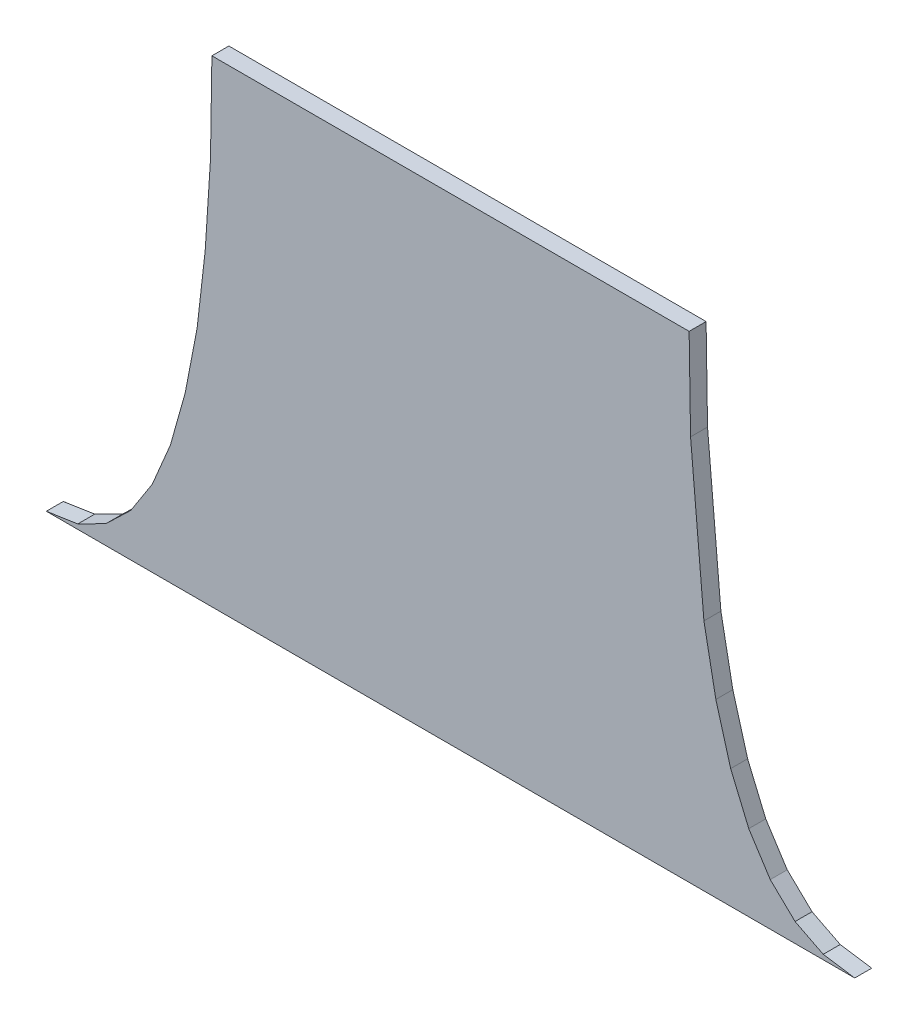
ISO-10303-21;
HEADER;
FILE_DESCRIPTION(('STEP AP214'),'2;1');
FILE_NAME('part.step','',(''),(''),'','','');
FILE_SCHEMA(('AUTOMOTIVE_DESIGN { 1 0 10303 214 1 1 1 1 }'));
ENDSEC;
DATA;
#1=APPLICATION_CONTEXT('core data for automotive mechanical design processes');
#2=APPLICATION_PROTOCOL_DEFINITION('international standard','automotive_design',2000,#1);
#3=PRODUCT_CONTEXT('',#1,'mechanical');
#4=PRODUCT('Part','Part','',(#3));
#5=PRODUCT_RELATED_PRODUCT_CATEGORY('part','',(#4));
#6=PRODUCT_DEFINITION_FORMATION('','',#4);
#7=PRODUCT_DEFINITION_CONTEXT('part definition',#1,'design');
#8=PRODUCT_DEFINITION('design','',#6,#7);
#9=PRODUCT_DEFINITION_SHAPE('','',#8);
#10=(LENGTH_UNIT() NAMED_UNIT(*) SI_UNIT(.MILLI.,.METRE.));
#11=(NAMED_UNIT(*) PLANE_ANGLE_UNIT() SI_UNIT($,.RADIAN.));
#12=(NAMED_UNIT(*) SI_UNIT($,.STERADIAN.) SOLID_ANGLE_UNIT());
#13=UNCERTAINTY_MEASURE_WITH_UNIT(LENGTH_MEASURE(1.E-05),#10,'distance_accuracy_value','');
#14=(GEOMETRIC_REPRESENTATION_CONTEXT(3) GLOBAL_UNCERTAINTY_ASSIGNED_CONTEXT((#13)) GLOBAL_UNIT_ASSIGNED_CONTEXT((#10,
#11,#12)) REPRESENTATION_CONTEXT('',''));
#15=CARTESIAN_POINT('',(0.,0.,0.));
#16=DIRECTION('',(0.,0.,1.));
#17=DIRECTION('',(1.,0.,0.));
#18=AXIS2_PLACEMENT_3D('',#15,#16,#17);
#19=CARTESIAN_POINT('',(45.5,64.4469985961914,0.));
#20=DIRECTION('',(0.999875499625645,-0.0157792664077773,0.));
#21=DIRECTION('',(-0.0157792664077773,-0.999875499625645,0.));
#22=AXIS2_PLACEMENT_3D('',#19,#20,#21);
#23=PLANE('',#22);
#24=DIRECTION('',(-0.0157792664077773,-0.999875499625645,0.));
#25=VECTOR('',#24,1.);
#26=CARTESIAN_POINT('',(45.5,64.4469985961914,0.03556));
#27=LINE('',#26,#25);
#28=CARTESIAN_POINT('',(45.5,64.4469985961914,0.03556));
#29=VERTEX_POINT('',#28);
#30=CARTESIAN_POINT('',(45.4970016479492,64.2570037841797,0.03556));
#31=VERTEX_POINT('',#30);
#32=EDGE_CURVE('E11',#29,#31,#27,.T.);
#33=ORIENTED_EDGE('',*,*,#32,.F.);
#34=DIRECTION('',(0.,0.,1.));
#35=VECTOR('',#34,1.);
#36=CARTESIAN_POINT('',(45.5,64.4469985961914,0.));
#37=LINE('',#36,#35);
#38=CARTESIAN_POINT('',(45.5,64.4469985961914,0.));
#39=VERTEX_POINT('',#38);
#40=EDGE_CURVE('E24',#39,#29,#37,.T.);
#41=ORIENTED_EDGE('',*,*,#40,.F.);
#42=DIRECTION('',(-0.0157792664077773,-0.999875499625645,0.));
#43=VECTOR('',#42,1.);
#44=CARTESIAN_POINT('',(45.5,64.4469985961914,0.));
#45=LINE('',#44,#43);
#46=CARTESIAN_POINT('',(45.4970016479492,64.2570037841797,0.));
#47=VERTEX_POINT('',#46);
#48=EDGE_CURVE('E178',#39,#47,#45,.T.);
#49=ORIENTED_EDGE('',*,*,#48,.T.);
#50=DIRECTION('',(0.,0.,1.));
#51=VECTOR('',#50,1.);
#52=CARTESIAN_POINT('',(45.4970016479492,64.2570037841797,0.));
#53=LINE('',#52,#51);
#54=EDGE_CURVE('E37',#47,#31,#53,.T.);
#55=ORIENTED_EDGE('',*,*,#54,.T.);
#56=EDGE_LOOP('',(#33,#41,#49,#55));
#57=FACE_BOUND('',#56,.T.);
#58=ADVANCED_FACE('F17',(#57),#23,.F.);
#59=CARTESIAN_POINT('',(45.4970016479492,64.2570037841797,0.));
#60=DIRECTION('',(0.997912666849635,-0.0645779323070131,0.));
#61=DIRECTION('',(-0.0645779323070131,-0.997912666849635,0.));
#62=AXIS2_PLACEMENT_3D('',#59,#60,#61);
#63=PLANE('',#62);
#64=DIRECTION('',(-0.0645779323070131,-0.997912666849635,0.));
#65=VECTOR('',#64,1.);
#66=CARTESIAN_POINT('',(45.4970016479492,64.2570037841797,0.03556));
#67=LINE('',#66,#65);
#68=CARTESIAN_POINT('',(45.4860000610352,64.0869979858398,0.03556));
#69=VERTEX_POINT('',#68);
#70=EDGE_CURVE('E322',#31,#69,#67,.T.);
#71=ORIENTED_EDGE('',*,*,#70,.F.);
#72=ORIENTED_EDGE('',*,*,#54,.F.);
#73=DIRECTION('',(-0.0645779323070131,-0.997912666849635,0.));
#74=VECTOR('',#73,1.);
#75=CARTESIAN_POINT('',(45.4970016479492,64.2570037841797,0.));
#76=LINE('',#75,#74);
#77=CARTESIAN_POINT('',(45.4860000610352,64.0869979858398,0.));
#78=VERTEX_POINT('',#77);
#79=EDGE_CURVE('E319',#47,#78,#76,.T.);
#80=ORIENTED_EDGE('',*,*,#79,.T.);
#81=DIRECTION('',(0.,0.,1.));
#82=VECTOR('',#81,1.);
#83=CARTESIAN_POINT('',(45.4860000610352,64.0869979858398,0.));
#84=LINE('',#83,#82);
#85=EDGE_CURVE('E317',#78,#69,#84,.T.);
#86=ORIENTED_EDGE('',*,*,#85,.T.);
#87=EDGE_LOOP('',(#71,#72,#80,#86));
#88=FACE_BOUND('',#87,.T.);
#89=ADVANCED_FACE('F330',(#88),#63,.F.);
#90=CARTESIAN_POINT('',(45.4860000610352,64.0869979858398,0.));
#91=DIRECTION('',(0.993640064778692,-0.112602938090431,0.));
#92=DIRECTION('',(-0.112602938090431,-0.993640064778692,0.));
#93=AXIS2_PLACEMENT_3D('',#90,#91,#92);
#94=PLANE('',#93);
#95=DIRECTION('',(-0.112602938090431,-0.993640064778692,0.));
#96=VECTOR('',#95,1.);
#97=CARTESIAN_POINT('',(45.4860000610352,64.0869979858398,0.03556));
#98=LINE('',#97,#96);
#99=CARTESIAN_POINT('',(45.4690017700195,63.9370002746582,0.03556));
#100=VERTEX_POINT('',#99);
#101=EDGE_CURVE('E314',#69,#100,#98,.T.);
#102=ORIENTED_EDGE('',*,*,#101,.F.);
#103=ORIENTED_EDGE('',*,*,#85,.F.);
#104=DIRECTION('',(-0.112602938090431,-0.993640064778692,0.));
#105=VECTOR('',#104,1.);
#106=CARTESIAN_POINT('',(45.4860000610352,64.0869979858398,0.));
#107=LINE('',#106,#105);
#108=CARTESIAN_POINT('',(45.4690017700195,63.9370002746582,0.));
#109=VERTEX_POINT('',#108);
#110=EDGE_CURVE('E311',#78,#109,#107,.T.);
#111=ORIENTED_EDGE('',*,*,#110,.T.);
#112=DIRECTION('',(0.,0.,1.));
#113=VECTOR('',#112,1.);
#114=CARTESIAN_POINT('',(45.4690017700195,63.9370002746582,0.));
#115=LINE('',#114,#113);
#116=EDGE_CURVE('E309',#109,#100,#115,.T.);
#117=ORIENTED_EDGE('',*,*,#116,.T.);
#118=EDGE_LOOP('',(#102,#103,#111,#117));
#119=FACE_BOUND('',#118,.T.);
#120=ADVANCED_FACE('F336',(#119),#94,.F.);
#121=CARTESIAN_POINT('',(45.4690017700195,63.9370002746582,0.));
#122=DIRECTION('',(0.982004597148876,-0.18885701252131,0.));
#123=DIRECTION('',(-0.18885701252131,-0.982004597148876,0.));
#124=AXIS2_PLACEMENT_3D('',#121,#122,#123);
#125=PLANE('',#124);
#126=DIRECTION('',(-0.18885701252131,-0.982004597148876,0.));
#127=VECTOR('',#126,1.);
#128=CARTESIAN_POINT('',(45.4690017700195,63.9370002746582,0.03556));
#129=LINE('',#128,#127);
#130=CARTESIAN_POINT('',(45.4440002441406,63.806999206543,0.03556));
#131=VERTEX_POINT('',#130);
#132=EDGE_CURVE('E306',#100,#131,#129,.T.);
#133=ORIENTED_EDGE('',*,*,#132,.F.);
#134=ORIENTED_EDGE('',*,*,#116,.F.);
#135=DIRECTION('',(-0.18885701252131,-0.982004597148876,0.));
#136=VECTOR('',#135,1.);
#137=CARTESIAN_POINT('',(45.4690017700195,63.9370002746582,0.));
#138=LINE('',#137,#136);
#139=CARTESIAN_POINT('',(45.4440002441406,63.806999206543,0.));
#140=VERTEX_POINT('',#139);
#141=EDGE_CURVE('E303',#109,#140,#138,.T.);
#142=ORIENTED_EDGE('',*,*,#141,.T.);
#143=DIRECTION('',(0.,0.,1.));
#144=VECTOR('',#143,1.);
#145=CARTESIAN_POINT('',(45.4440002441406,63.806999206543,0.));
#146=LINE('',#145,#144);
#147=EDGE_CURVE('E301',#140,#131,#146,.T.);
#148=ORIENTED_EDGE('',*,*,#147,.T.);
#149=EDGE_LOOP('',(#133,#134,#142,#148));
#150=FACE_BOUND('',#149,.T.);
#151=ADVANCED_FACE('F338',(#150),#125,.F.);
#152=CARTESIAN_POINT('',(45.4440002441406,63.806999206543,0.));
#153=DIRECTION('',(0.962503993414484,-0.271267511252584,0.));
#154=DIRECTION('',(-0.271267511252584,-0.962503993414484,0.));
#155=AXIS2_PLACEMENT_3D('',#152,#153,#154);
#156=PLANE('',#155);
#157=DIRECTION('',(-0.271267511252584,-0.962503993414484,0.));
#158=VECTOR('',#157,1.);
#159=CARTESIAN_POINT('',(45.4440002441406,63.806999206543,0.03556));
#160=LINE('',#159,#158);
#161=CARTESIAN_POINT('',(45.4129981994629,63.6969985961914,0.03556));
#162=VERTEX_POINT('',#161);
#163=EDGE_CURVE('E298',#131,#162,#160,.T.);
#164=ORIENTED_EDGE('',*,*,#163,.F.);
#165=ORIENTED_EDGE('',*,*,#147,.F.);
#166=DIRECTION('',(-0.271267511252584,-0.962503993414484,0.));
#167=VECTOR('',#166,1.);
#168=CARTESIAN_POINT('',(45.4440002441406,63.806999206543,0.));
#169=LINE('',#168,#167);
#170=CARTESIAN_POINT('',(45.4129981994629,63.6969985961914,0.));
#171=VERTEX_POINT('',#170);
#172=EDGE_CURVE('E295',#140,#171,#169,.T.);
#173=ORIENTED_EDGE('',*,*,#172,.T.);
#174=DIRECTION('',(0.,0.,1.));
#175=VECTOR('',#174,1.);
#176=CARTESIAN_POINT('',(45.4129981994629,63.6969985961914,0.));
#177=LINE('',#176,#175);
#178=EDGE_CURVE('E293',#171,#162,#177,.T.);
#179=ORIENTED_EDGE('',*,*,#178,.T.);
#180=EDGE_LOOP('',(#164,#165,#173,#179));
#181=FACE_BOUND('',#180,.T.);
#182=ADVANCED_FACE('F343',(#181),#156,.F.);
#183=CARTESIAN_POINT('',(45.4129981994629,63.6969985961914,0.));
#184=DIRECTION('',(0.921256402010641,-0.388955835223498,0.));
#185=DIRECTION('',(-0.388955835223498,-0.921256402010641,0.));
#186=AXIS2_PLACEMENT_3D('',#183,#184,#185);
#187=PLANE('',#186);
#188=DIRECTION('',(-0.388955835223498,-0.921256402010641,0.));
#189=VECTOR('',#188,1.);
#190=CARTESIAN_POINT('',(45.4129981994629,63.6969985961914,0.03556));
#191=LINE('',#190,#189);
#192=CARTESIAN_POINT('',(45.375,63.6069984436035,0.03556));
#193=VERTEX_POINT('',#192);
#194=EDGE_CURVE('E290',#162,#193,#191,.T.);
#195=ORIENTED_EDGE('',*,*,#194,.F.);
#196=ORIENTED_EDGE('',*,*,#178,.F.);
#197=DIRECTION('',(-0.388955835223498,-0.921256402010641,0.));
#198=VECTOR('',#197,1.);
#199=CARTESIAN_POINT('',(45.4129981994629,63.6969985961914,0.));
#200=LINE('',#199,#198);
#201=CARTESIAN_POINT('',(45.375,63.6069984436035,0.));
#202=VERTEX_POINT('',#201);
#203=EDGE_CURVE('E287',#171,#202,#200,.T.);
#204=ORIENTED_EDGE('',*,*,#203,.T.);
#205=DIRECTION('',(0.,0.,1.));
#206=VECTOR('',#205,1.);
#207=CARTESIAN_POINT('',(45.375,63.6069984436035,0.));
#208=LINE('',#207,#206);
#209=EDGE_CURVE('E285',#202,#193,#208,.T.);
#210=ORIENTED_EDGE('',*,*,#209,.T.);
#211=EDGE_LOOP('',(#195,#196,#204,#210));
#212=FACE_BOUND('',#211,.T.);
#213=ADVANCED_FACE('F346',(#212),#187,.F.);
#214=CARTESIAN_POINT('',(45.375,63.6069984436035,0.));
#215=DIRECTION('',(0.841187411828098,-0.540743689914128,0.));
#216=DIRECTION('',(-0.540743689914128,-0.841187411828098,0.));
#217=AXIS2_PLACEMENT_3D('',#214,#215,#216);
#218=PLANE('',#217);
#219=DIRECTION('',(-0.540743689914128,-0.841187411828098,0.));
#220=VECTOR('',#219,1.);
#221=CARTESIAN_POINT('',(45.375,63.6069984436035,0.03556));
#222=LINE('',#221,#220);
#223=CARTESIAN_POINT('',(45.3300018310547,63.5369987487793,0.03556));
#224=VERTEX_POINT('',#223);
#225=EDGE_CURVE('E282',#193,#224,#222,.T.);
#226=ORIENTED_EDGE('',*,*,#225,.F.);
#227=ORIENTED_EDGE('',*,*,#209,.F.);
#228=DIRECTION('',(-0.540743689914128,-0.841187411828098,0.));
#229=VECTOR('',#228,1.);
#230=CARTESIAN_POINT('',(45.375,63.6069984436035,0.));
#231=LINE('',#230,#229);
#232=CARTESIAN_POINT('',(45.3300018310547,63.5369987487793,0.));
#233=VERTEX_POINT('',#232);
#234=EDGE_CURVE('E279',#202,#233,#231,.T.);
#235=ORIENTED_EDGE('',*,*,#234,.T.);
#236=DIRECTION('',(0.,0.,1.));
#237=VECTOR('',#236,1.);
#238=CARTESIAN_POINT('',(45.3300018310547,63.5369987487793,0.));
#239=LINE('',#238,#237);
#240=EDGE_CURVE('E277',#233,#224,#239,.T.);
#241=ORIENTED_EDGE('',*,*,#240,.T.);
#242=EDGE_LOOP('',(#226,#227,#235,#241));
#243=FACE_BOUND('',#242,.T.);
#244=ADVANCED_FACE('F351',(#243),#218,.F.);
#245=CARTESIAN_POINT('',(45.3300018310547,63.5369987487793,0.));
#246=DIRECTION('',(0.693089694075239,-0.720851354973195,0.));
#247=DIRECTION('',(-0.720851354973195,-0.693089694075239,0.));
#248=AXIS2_PLACEMENT_3D('',#245,#246,#247);
#249=PLANE('',#248);
#250=DIRECTION('',(-0.720851354973195,-0.693089694075239,0.));
#251=VECTOR('',#250,1.);
#252=CARTESIAN_POINT('',(45.3300018310547,63.5369987487793,0.03556));
#253=LINE('',#252,#251);
#254=CARTESIAN_POINT('',(45.2779998779297,63.4869995117188,0.03556));
#255=VERTEX_POINT('',#254);
#256=EDGE_CURVE('E274',#224,#255,#253,.T.);
#257=ORIENTED_EDGE('',*,*,#256,.F.);
#258=ORIENTED_EDGE('',*,*,#240,.F.);
#259=DIRECTION('',(-0.720851354973195,-0.693089694075239,0.));
#260=VECTOR('',#259,1.);
#261=CARTESIAN_POINT('',(45.3300018310547,63.5369987487793,0.));
#262=LINE('',#261,#260);
#263=CARTESIAN_POINT('',(45.2779998779297,63.4869995117188,0.));
#264=VERTEX_POINT('',#263);
#265=EDGE_CURVE('E271',#233,#264,#262,.T.);
#266=ORIENTED_EDGE('',*,*,#265,.T.);
#267=DIRECTION('',(0.,0.,1.));
#268=VECTOR('',#267,1.);
#269=CARTESIAN_POINT('',(45.2779998779297,63.4869995117188,0.));
#270=LINE('',#269,#268);
#271=EDGE_CURVE('E269',#264,#255,#270,.T.);
#272=ORIENTED_EDGE('',*,*,#271,.T.);
#273=EDGE_LOOP('',(#257,#258,#266,#272));
#274=FACE_BOUND('',#273,.T.);
#275=ADVANCED_FACE('F354',(#274),#249,.F.);
#276=CARTESIAN_POINT('',(45.2779998779297,63.4869995117188,0.));
#277=DIRECTION('',(0.453243571621716,-0.891386708888791,0.));
#278=DIRECTION('',(-0.891386708888791,-0.453243571621716,0.));
#279=AXIS2_PLACEMENT_3D('',#276,#277,#278);
#280=PLANE('',#279);
#281=DIRECTION('',(-0.891386708888791,-0.453243571621716,0.));
#282=VECTOR('',#281,1.);
#283=CARTESIAN_POINT('',(45.2779998779297,63.4869995117188,0.03556));
#284=LINE('',#283,#282);
#285=CARTESIAN_POINT('',(45.2190017700195,63.4570007324219,0.03556));
#286=VERTEX_POINT('',#285);
#287=EDGE_CURVE('E266',#255,#286,#284,.T.);
#288=ORIENTED_EDGE('',*,*,#287,.F.);
#289=ORIENTED_EDGE('',*,*,#271,.F.);
#290=DIRECTION('',(-0.891386708888791,-0.453243571621716,0.));
#291=VECTOR('',#290,1.);
#292=CARTESIAN_POINT('',(45.2779998779297,63.4869995117188,0.));
#293=LINE('',#292,#291);
#294=CARTESIAN_POINT('',(45.2190017700195,63.4570007324219,0.));
#295=VERTEX_POINT('',#294);
#296=EDGE_CURVE('E263',#264,#295,#293,.T.);
#297=ORIENTED_EDGE('',*,*,#296,.T.);
#298=DIRECTION('',(0.,0.,1.));
#299=VECTOR('',#298,1.);
#300=CARTESIAN_POINT('',(45.2190017700195,63.4570007324219,0.));
#301=LINE('',#300,#299);
#302=EDGE_CURVE('E261',#295,#286,#301,.T.);
#303=ORIENTED_EDGE('',*,*,#302,.T.);
#304=EDGE_LOOP('',(#288,#289,#297,#303));
#305=FACE_BOUND('',#304,.T.);
#306=ADVANCED_FACE('F359',(#305),#280,.F.);
#307=CARTESIAN_POINT('',(45.2190017700195,63.4570007324219,0.));
#308=DIRECTION('',(0.149832463943078,-0.98871140013087,0.));
#309=DIRECTION('',(-0.98871140013087,-0.149832463943078,0.));
#310=AXIS2_PLACEMENT_3D('',#307,#308,#309);
#311=PLANE('',#310);
#312=DIRECTION('',(-0.98871140013087,-0.149832463943078,0.));
#313=VECTOR('',#312,1.);
#314=CARTESIAN_POINT('',(45.2190017700195,63.4570007324219,0.03556));
#315=LINE('',#314,#313);
#316=CARTESIAN_POINT('',(45.1529998779297,63.4469985961914,0.03556));
#317=VERTEX_POINT('',#316);
#318=EDGE_CURVE('E258',#286,#317,#315,.T.);
#319=ORIENTED_EDGE('',*,*,#318,.F.);
#320=ORIENTED_EDGE('',*,*,#302,.F.);
#321=DIRECTION('',(-0.98871140013087,-0.149832463943078,0.));
#322=VECTOR('',#321,1.);
#323=CARTESIAN_POINT('',(45.2190017700195,63.4570007324219,0.));
#324=LINE('',#323,#322);
#325=CARTESIAN_POINT('',(45.1529998779297,63.4469985961914,0.));
#326=VERTEX_POINT('',#325);
#327=EDGE_CURVE('E255',#295,#326,#324,.T.);
#328=ORIENTED_EDGE('',*,*,#327,.T.);
#329=DIRECTION('',(0.,0.,1.));
#330=VECTOR('',#329,1.);
#331=CARTESIAN_POINT('',(45.1529998779297,63.4469985961914,0.));
#332=LINE('',#331,#330);
#333=EDGE_CURVE('E253',#326,#317,#332,.T.);
#334=ORIENTED_EDGE('',*,*,#333,.T.);
#335=EDGE_LOOP('',(#319,#320,#328,#334));
#336=FACE_BOUND('',#335,.T.);
#337=ADVANCED_FACE('F362',(#336),#311,.F.);
#338=CARTESIAN_POINT('',(45.1529998779297,63.4469985961914,0.));
#339=DIRECTION('',(0.,1.,0.));
#340=DIRECTION('',(1.,0.,0.));
#341=AXIS2_PLACEMENT_3D('',#338,#339,#340);
#342=PLANE('',#341);
#343=DIRECTION('',(1.,0.,0.));
#344=VECTOR('',#343,1.);
#345=CARTESIAN_POINT('',(45.1529998779297,63.4469985961914,0.03556));
#346=LINE('',#345,#344);
#347=CARTESIAN_POINT('',(46.8470001220703,63.4469985961914,0.03556));
#348=VERTEX_POINT('',#347);
#349=EDGE_CURVE('E250',#317,#348,#346,.T.);
#350=ORIENTED_EDGE('',*,*,#349,.F.);
#351=ORIENTED_EDGE('',*,*,#333,.F.);
#352=DIRECTION('',(1.,0.,0.));
#353=VECTOR('',#352,1.);
#354=CARTESIAN_POINT('',(45.1529998779297,63.4469985961914,0.));
#355=LINE('',#354,#353);
#356=CARTESIAN_POINT('',(46.8470001220703,63.4469985961914,0.));
#357=VERTEX_POINT('',#356);
#358=EDGE_CURVE('E247',#326,#357,#355,.T.);
#359=ORIENTED_EDGE('',*,*,#358,.T.);
#360=DIRECTION('',(0.,0.,1.));
#361=VECTOR('',#360,1.);
#362=CARTESIAN_POINT('',(46.8470001220703,63.4469985961914,0.));
#363=LINE('',#362,#361);
#364=EDGE_CURVE('E245',#357,#348,#363,.T.);
#365=ORIENTED_EDGE('',*,*,#364,.T.);
#366=EDGE_LOOP('',(#350,#351,#359,#365));
#367=FACE_BOUND('',#366,.T.);
#368=ADVANCED_FACE('F367',(#367),#342,.F.);
#369=CARTESIAN_POINT('',(46.8470001220703,63.4469985961914,0.));
#370=DIRECTION('',(-0.149832463943078,-0.98871140013087,0.));
#371=DIRECTION('',(-0.98871140013087,0.149832463943078,0.));
#372=AXIS2_PLACEMENT_3D('',#369,#370,#371);
#373=PLANE('',#372);
#374=DIRECTION('',(-0.98871140013087,0.149832463943078,0.));
#375=VECTOR('',#374,1.);
#376=CARTESIAN_POINT('',(46.8470001220703,63.4469985961914,0.03556));
#377=LINE('',#376,#375);
#378=CARTESIAN_POINT('',(46.7809982299805,63.4570007324219,0.03556));
#379=VERTEX_POINT('',#378);
#380=EDGE_CURVE('E242',#348,#379,#377,.T.);
#381=ORIENTED_EDGE('',*,*,#380,.F.);
#382=ORIENTED_EDGE('',*,*,#364,.F.);
#383=DIRECTION('',(-0.98871140013087,0.149832463943078,0.));
#384=VECTOR('',#383,1.);
#385=CARTESIAN_POINT('',(46.8470001220703,63.4469985961914,0.));
#386=LINE('',#385,#384);
#387=CARTESIAN_POINT('',(46.7809982299805,63.4570007324219,0.));
#388=VERTEX_POINT('',#387);
#389=EDGE_CURVE('E239',#357,#388,#386,.T.);
#390=ORIENTED_EDGE('',*,*,#389,.T.);
#391=DIRECTION('',(0.,0.,1.));
#392=VECTOR('',#391,1.);
#393=CARTESIAN_POINT('',(46.7809982299805,63.4570007324219,0.));
#394=LINE('',#393,#392);
#395=EDGE_CURVE('E237',#388,#379,#394,.T.);
#396=ORIENTED_EDGE('',*,*,#395,.T.);
#397=EDGE_LOOP('',(#381,#382,#390,#396));
#398=FACE_BOUND('',#397,.T.);
#399=ADVANCED_FACE('F370',(#398),#373,.F.);
#400=CARTESIAN_POINT('',(46.7809982299805,63.4570007324219,0.));
#401=DIRECTION('',(-0.453243571621716,-0.891386708888791,0.));
#402=DIRECTION('',(-0.891386708888791,0.453243571621716,0.));
#403=AXIS2_PLACEMENT_3D('',#400,#401,#402);
#404=PLANE('',#403);
#405=DIRECTION('',(-0.891386708888791,0.453243571621716,0.));
#406=VECTOR('',#405,1.);
#407=CARTESIAN_POINT('',(46.7809982299805,63.4570007324219,0.03556));
#408=LINE('',#407,#406);
#409=CARTESIAN_POINT('',(46.7220001220703,63.4869995117188,0.03556));
#410=VERTEX_POINT('',#409);
#411=EDGE_CURVE('E234',#379,#410,#408,.T.);
#412=ORIENTED_EDGE('',*,*,#411,.F.);
#413=ORIENTED_EDGE('',*,*,#395,.F.);
#414=DIRECTION('',(-0.891386708888791,0.453243571621716,0.));
#415=VECTOR('',#414,1.);
#416=CARTESIAN_POINT('',(46.7809982299805,63.4570007324219,0.));
#417=LINE('',#416,#415);
#418=CARTESIAN_POINT('',(46.7220001220703,63.4869995117188,0.));
#419=VERTEX_POINT('',#418);
#420=EDGE_CURVE('E231',#388,#419,#417,.T.);
#421=ORIENTED_EDGE('',*,*,#420,.T.);
#422=DIRECTION('',(0.,0.,1.));
#423=VECTOR('',#422,1.);
#424=CARTESIAN_POINT('',(46.7220001220703,63.4869995117188,0.));
#425=LINE('',#424,#423);
#426=EDGE_CURVE('E229',#419,#410,#425,.T.);
#427=ORIENTED_EDGE('',*,*,#426,.T.);
#428=EDGE_LOOP('',(#412,#413,#421,#427));
#429=FACE_BOUND('',#428,.T.);
#430=ADVANCED_FACE('F375',(#429),#404,.F.);
#431=CARTESIAN_POINT('',(46.7220001220703,63.4869995117188,0.));
#432=DIRECTION('',(-0.693089694075239,-0.720851354973195,0.));
#433=DIRECTION('',(-0.720851354973195,0.693089694075239,0.));
#434=AXIS2_PLACEMENT_3D('',#431,#432,#433);
#435=PLANE('',#434);
#436=DIRECTION('',(-0.720851354973195,0.693089694075239,0.));
#437=VECTOR('',#436,1.);
#438=CARTESIAN_POINT('',(46.7220001220703,63.4869995117188,0.03556));
#439=LINE('',#438,#437);
#440=CARTESIAN_POINT('',(46.6699981689453,63.5369987487793,0.03556));
#441=VERTEX_POINT('',#440);
#442=EDGE_CURVE('E226',#410,#441,#439,.T.);
#443=ORIENTED_EDGE('',*,*,#442,.F.);
#444=ORIENTED_EDGE('',*,*,#426,.F.);
#445=DIRECTION('',(-0.720851354973195,0.693089694075239,0.));
#446=VECTOR('',#445,1.);
#447=CARTESIAN_POINT('',(46.7220001220703,63.4869995117188,0.));
#448=LINE('',#447,#446);
#449=CARTESIAN_POINT('',(46.6699981689453,63.5369987487793,0.));
#450=VERTEX_POINT('',#449);
#451=EDGE_CURVE('E223',#419,#450,#448,.T.);
#452=ORIENTED_EDGE('',*,*,#451,.T.);
#453=DIRECTION('',(0.,0.,1.));
#454=VECTOR('',#453,1.);
#455=CARTESIAN_POINT('',(46.6699981689453,63.5369987487793,0.));
#456=LINE('',#455,#454);
#457=EDGE_CURVE('E221',#450,#441,#456,.T.);
#458=ORIENTED_EDGE('',*,*,#457,.T.);
#459=EDGE_LOOP('',(#443,#444,#452,#458));
#460=FACE_BOUND('',#459,.T.);
#461=ADVANCED_FACE('F378',(#460),#435,.F.);
#462=CARTESIAN_POINT('',(46.6699981689453,63.5369987487793,0.));
#463=DIRECTION('',(-0.841187411828098,-0.540743689914128,0.));
#464=DIRECTION('',(-0.540743689914128,0.841187411828098,0.));
#465=AXIS2_PLACEMENT_3D('',#462,#463,#464);
#466=PLANE('',#465);
#467=DIRECTION('',(-0.540743689914128,0.841187411828098,0.));
#468=VECTOR('',#467,1.);
#469=CARTESIAN_POINT('',(46.6699981689453,63.5369987487793,0.03556));
#470=LINE('',#469,#468);
#471=CARTESIAN_POINT('',(46.625,63.6069984436035,0.03556));
#472=VERTEX_POINT('',#471);
#473=EDGE_CURVE('E218',#441,#472,#470,.T.);
#474=ORIENTED_EDGE('',*,*,#473,.F.);
#475=ORIENTED_EDGE('',*,*,#457,.F.);
#476=DIRECTION('',(-0.540743689914128,0.841187411828098,0.));
#477=VECTOR('',#476,1.);
#478=CARTESIAN_POINT('',(46.6699981689453,63.5369987487793,0.));
#479=LINE('',#478,#477);
#480=CARTESIAN_POINT('',(46.625,63.6069984436035,0.));
#481=VERTEX_POINT('',#480);
#482=EDGE_CURVE('E215',#450,#481,#479,.T.);
#483=ORIENTED_EDGE('',*,*,#482,.T.);
#484=DIRECTION('',(0.,0.,1.));
#485=VECTOR('',#484,1.);
#486=CARTESIAN_POINT('',(46.625,63.6069984436035,0.));
#487=LINE('',#486,#485);
#488=EDGE_CURVE('E213',#481,#472,#487,.T.);
#489=ORIENTED_EDGE('',*,*,#488,.T.);
#490=EDGE_LOOP('',(#474,#475,#483,#489));
#491=FACE_BOUND('',#490,.T.);
#492=ADVANCED_FACE('F383',(#491),#466,.F.);
#493=CARTESIAN_POINT('',(46.625,63.6069984436035,0.));
#494=DIRECTION('',(-0.921256402010641,-0.388955835223498,0.));
#495=DIRECTION('',(-0.388955835223498,0.921256402010641,0.));
#496=AXIS2_PLACEMENT_3D('',#493,#494,#495);
#497=PLANE('',#496);
#498=DIRECTION('',(-0.388955835223498,0.921256402010641,0.));
#499=VECTOR('',#498,1.);
#500=CARTESIAN_POINT('',(46.625,63.6069984436035,0.03556));
#501=LINE('',#500,#499);
#502=CARTESIAN_POINT('',(46.5870018005371,63.6969985961914,0.03556));
#503=VERTEX_POINT('',#502);
#504=EDGE_CURVE('E210',#472,#503,#501,.T.);
#505=ORIENTED_EDGE('',*,*,#504,.F.);
#506=ORIENTED_EDGE('',*,*,#488,.F.);
#507=DIRECTION('',(-0.388955835223498,0.921256402010641,0.));
#508=VECTOR('',#507,1.);
#509=CARTESIAN_POINT('',(46.625,63.6069984436035,0.));
#510=LINE('',#509,#508);
#511=CARTESIAN_POINT('',(46.5870018005371,63.6969985961914,0.));
#512=VERTEX_POINT('',#511);
#513=EDGE_CURVE('E207',#481,#512,#510,.T.);
#514=ORIENTED_EDGE('',*,*,#513,.T.);
#515=DIRECTION('',(0.,0.,1.));
#516=VECTOR('',#515,1.);
#517=CARTESIAN_POINT('',(46.5870018005371,63.6969985961914,0.));
#518=LINE('',#517,#516);
#519=EDGE_CURVE('E205',#512,#503,#518,.T.);
#520=ORIENTED_EDGE('',*,*,#519,.T.);
#521=EDGE_LOOP('',(#505,#506,#514,#520));
#522=FACE_BOUND('',#521,.T.);
#523=ADVANCED_FACE('F386',(#522),#497,.F.);
#524=CARTESIAN_POINT('',(46.5870018005371,63.6969985961914,0.));
#525=DIRECTION('',(-0.962503993414484,-0.271267511252584,0.));
#526=DIRECTION('',(-0.271267511252584,0.962503993414484,0.));
#527=AXIS2_PLACEMENT_3D('',#524,#525,#526);
#528=PLANE('',#527);
#529=DIRECTION('',(-0.271267511252584,0.962503993414484,0.));
#530=VECTOR('',#529,1.);
#531=CARTESIAN_POINT('',(46.5870018005371,63.6969985961914,0.03556));
#532=LINE('',#531,#530);
#533=CARTESIAN_POINT('',(46.5559997558594,63.806999206543,0.03556));
#534=VERTEX_POINT('',#533);
#535=EDGE_CURVE('E202',#503,#534,#532,.T.);
#536=ORIENTED_EDGE('',*,*,#535,.F.);
#537=ORIENTED_EDGE('',*,*,#519,.F.);
#538=DIRECTION('',(-0.271267511252584,0.962503993414484,0.));
#539=VECTOR('',#538,1.);
#540=CARTESIAN_POINT('',(46.5870018005371,63.6969985961914,0.));
#541=LINE('',#540,#539);
#542=CARTESIAN_POINT('',(46.5559997558594,63.806999206543,0.));
#543=VERTEX_POINT('',#542);
#544=EDGE_CURVE('E199',#512,#543,#541,.T.);
#545=ORIENTED_EDGE('',*,*,#544,.T.);
#546=DIRECTION('',(0.,0.,1.));
#547=VECTOR('',#546,1.);
#548=CARTESIAN_POINT('',(46.5559997558594,63.806999206543,0.));
#549=LINE('',#548,#547);
#550=EDGE_CURVE('E197',#543,#534,#549,.T.);
#551=ORIENTED_EDGE('',*,*,#550,.T.);
#552=EDGE_LOOP('',(#536,#537,#545,#551));
#553=FACE_BOUND('',#552,.T.);
#554=ADVANCED_FACE('F391',(#553),#528,.F.);
#555=CARTESIAN_POINT('',(46.5559997558594,63.806999206543,0.));
#556=DIRECTION('',(-0.982004597148876,-0.18885701252131,0.));
#557=DIRECTION('',(-0.18885701252131,0.982004597148876,0.));
#558=AXIS2_PLACEMENT_3D('',#555,#556,#557);
#559=PLANE('',#558);
#560=DIRECTION('',(-0.18885701252131,0.982004597148876,0.));
#561=VECTOR('',#560,1.);
#562=CARTESIAN_POINT('',(46.5559997558594,63.806999206543,0.03556));
#563=LINE('',#562,#561);
#564=CARTESIAN_POINT('',(46.5309982299805,63.9370002746582,0.03556));
#565=VERTEX_POINT('',#564);
#566=EDGE_CURVE('E194',#534,#565,#563,.T.);
#567=ORIENTED_EDGE('',*,*,#566,.F.);
#568=ORIENTED_EDGE('',*,*,#550,.F.);
#569=DIRECTION('',(-0.18885701252131,0.982004597148876,0.));
#570=VECTOR('',#569,1.);
#571=CARTESIAN_POINT('',(46.5559997558594,63.806999206543,0.));
#572=LINE('',#571,#570);
#573=CARTESIAN_POINT('',(46.5309982299805,63.9370002746582,0.));
#574=VERTEX_POINT('',#573);
#575=EDGE_CURVE('E191',#543,#574,#572,.T.);
#576=ORIENTED_EDGE('',*,*,#575,.T.);
#577=DIRECTION('',(0.,0.,1.));
#578=VECTOR('',#577,1.);
#579=CARTESIAN_POINT('',(46.5309982299805,63.9370002746582,0.));
#580=LINE('',#579,#578);
#581=EDGE_CURVE('E189',#574,#565,#580,.T.);
#582=ORIENTED_EDGE('',*,*,#581,.T.);
#583=EDGE_LOOP('',(#567,#568,#576,#582));
#584=FACE_BOUND('',#583,.T.);
#585=ADVANCED_FACE('F394',(#584),#559,.F.);
#586=CARTESIAN_POINT('',(46.5309982299805,63.9370002746582,0.));
#587=DIRECTION('',(-0.996193833505747,-0.0871656244463645,0.));
#588=DIRECTION('',(-0.0871656244463645,0.996193833505747,0.));
#589=AXIS2_PLACEMENT_3D('',#586,#587,#588);
#590=PLANE('',#589);
#591=DIRECTION('',(-0.0871656244463645,0.996193833505747,0.));
#592=VECTOR('',#591,1.);
#593=CARTESIAN_POINT('',(46.5309982299805,63.9370002746582,0.03556));
#594=LINE('',#593,#592);
#595=CARTESIAN_POINT('',(46.5029983520508,64.2570037841797,0.03556));
#596=VERTEX_POINT('',#595);
#597=EDGE_CURVE('E186',#565,#596,#594,.T.);
#598=ORIENTED_EDGE('',*,*,#597,.F.);
#599=ORIENTED_EDGE('',*,*,#581,.F.);
#600=DIRECTION('',(-0.0871656244463645,0.996193833505747,0.));
#601=VECTOR('',#600,1.);
#602=CARTESIAN_POINT('',(46.5309982299805,63.9370002746582,0.));
#603=LINE('',#602,#601);
#604=CARTESIAN_POINT('',(46.5029983520508,64.2570037841797,0.));
#605=VERTEX_POINT('',#604);
#606=EDGE_CURVE('E184',#574,#605,#603,.T.);
#607=ORIENTED_EDGE('',*,*,#606,.T.);
#608=DIRECTION('',(0.,0.,1.));
#609=VECTOR('',#608,1.);
#610=CARTESIAN_POINT('',(46.5029983520508,64.2570037841797,0.));
#611=LINE('',#610,#609);
#612=EDGE_CURVE('E169',#605,#596,#611,.T.);
#613=ORIENTED_EDGE('',*,*,#612,.T.);
#614=EDGE_LOOP('',(#598,#599,#607,#613));
#615=FACE_BOUND('',#614,.T.);
#616=ADVANCED_FACE('F397',(#615),#590,.F.);
#617=CARTESIAN_POINT('',(46.5029983520508,64.2570037841797,0.));
#618=DIRECTION('',(-0.999875499625645,-0.0157792664077773,0.));
#619=DIRECTION('',(-0.0157792664077773,0.999875499625645,0.));
#620=AXIS2_PLACEMENT_3D('',#617,#618,#619);
#621=PLANE('',#620);
#622=DIRECTION('',(-0.0157792664077773,0.999875499625645,0.));
#623=VECTOR('',#622,1.);
#624=CARTESIAN_POINT('',(46.5029983520508,64.2570037841797,0.03556));
#625=LINE('',#624,#623);
#626=CARTESIAN_POINT('',(46.5,64.4469985961914,0.03556));
#627=VERTEX_POINT('',#626);
#628=EDGE_CURVE('E173',#596,#627,#625,.T.);
#629=ORIENTED_EDGE('',*,*,#628,.F.);
#630=ORIENTED_EDGE('',*,*,#612,.F.);
#631=DIRECTION('',(-0.0157792664077773,0.999875499625645,0.));
#632=VECTOR('',#631,1.);
#633=CARTESIAN_POINT('',(46.5029983520508,64.2570037841797,0.));
#634=LINE('',#633,#632);
#635=CARTESIAN_POINT('',(46.5,64.4469985961914,0.));
#636=VERTEX_POINT('',#635);
#637=EDGE_CURVE('E165',#605,#636,#634,.T.);
#638=ORIENTED_EDGE('',*,*,#637,.T.);
#639=DIRECTION('',(0.,0.,1.));
#640=VECTOR('',#639,1.);
#641=CARTESIAN_POINT('',(46.5,64.4469985961914,0.));
#642=LINE('',#641,#640);
#643=EDGE_CURVE('E155',#636,#627,#642,.T.);
#644=ORIENTED_EDGE('',*,*,#643,.T.);
#645=EDGE_LOOP('',(#629,#630,#638,#644));
#646=FACE_BOUND('',#645,.T.);
#647=ADVANCED_FACE('F168',(#646),#621,.F.);
#648=CARTESIAN_POINT('',(46.5,64.4469985961914,0.));
#649=DIRECTION('',(0.,-1.,0.));
#650=DIRECTION('',(-1.,0.,0.));
#651=AXIS2_PLACEMENT_3D('',#648,#649,#650);
#652=PLANE('',#651);
#653=DIRECTION('',(-1.,0.,0.));
#654=VECTOR('',#653,1.);
#655=CARTESIAN_POINT('',(46.5,64.4469985961914,0.03556));
#656=LINE('',#655,#654);
#657=EDGE_CURVE('E161',#627,#29,#656,.T.);
#658=ORIENTED_EDGE('',*,*,#657,.F.);
#659=ORIENTED_EDGE('',*,*,#643,.F.);
#660=DIRECTION('',(-1.,0.,0.));
#661=VECTOR('',#660,1.);
#662=CARTESIAN_POINT('',(46.5,64.4469985961914,0.));
#663=LINE('',#662,#661);
#664=EDGE_CURVE('E159',#636,#39,#663,.T.);
#665=ORIENTED_EDGE('',*,*,#664,.T.);
#666=ORIENTED_EDGE('',*,*,#40,.T.);
#667=EDGE_LOOP('',(#658,#659,#665,#666));
#668=FACE_BOUND('',#667,.T.);
#669=ADVANCED_FACE('F157',(#668),#652,.F.);
#670=CARTESIAN_POINT('',(45.5,64.4469985961914,0.));
#671=DIRECTION('',(0.,0.,1.));
#672=DIRECTION('',(1.,0.,0.));
#673=AXIS2_PLACEMENT_3D('',#670,#671,#672);
#674=PLANE('',#673);
#675=ORIENTED_EDGE('',*,*,#664,.F.);
#676=ORIENTED_EDGE('',*,*,#637,.F.);
#677=ORIENTED_EDGE('',*,*,#606,.F.);
#678=ORIENTED_EDGE('',*,*,#575,.F.);
#679=ORIENTED_EDGE('',*,*,#544,.F.);
#680=ORIENTED_EDGE('',*,*,#513,.F.);
#681=ORIENTED_EDGE('',*,*,#482,.F.);
#682=ORIENTED_EDGE('',*,*,#451,.F.);
#683=ORIENTED_EDGE('',*,*,#420,.F.);
#684=ORIENTED_EDGE('',*,*,#389,.F.);
#685=ORIENTED_EDGE('',*,*,#358,.F.);
#686=ORIENTED_EDGE('',*,*,#327,.F.);
#687=ORIENTED_EDGE('',*,*,#296,.F.);
#688=ORIENTED_EDGE('',*,*,#265,.F.);
#689=ORIENTED_EDGE('',*,*,#234,.F.);
#690=ORIENTED_EDGE('',*,*,#203,.F.);
#691=ORIENTED_EDGE('',*,*,#172,.F.);
#692=ORIENTED_EDGE('',*,*,#141,.F.);
#693=ORIENTED_EDGE('',*,*,#110,.F.);
#694=ORIENTED_EDGE('',*,*,#79,.F.);
#695=ORIENTED_EDGE('',*,*,#48,.F.);
#696=EDGE_LOOP('',(#675,#676,#677,#678,#679,#680,#681,#682,#683,#684,#685,#686,#687,#688,#689,
#690,#691,#692,#693,#694,#695));
#697=FACE_BOUND('',#696,.T.);
#698=ADVANCED_FACE('F176',(#697),#674,.F.);
#699=CARTESIAN_POINT('',(45.5,64.4469985961914,0.03556));
#700=DIRECTION('',(0.,0.,1.));
#701=DIRECTION('',(1.,0.,0.));
#702=AXIS2_PLACEMENT_3D('',#699,#700,#701);
#703=PLANE('',#702);
#704=ORIENTED_EDGE('',*,*,#32,.T.);
#705=ORIENTED_EDGE('',*,*,#70,.T.);
#706=ORIENTED_EDGE('',*,*,#101,.T.);
#707=ORIENTED_EDGE('',*,*,#132,.T.);
#708=ORIENTED_EDGE('',*,*,#163,.T.);
#709=ORIENTED_EDGE('',*,*,#194,.T.);
#710=ORIENTED_EDGE('',*,*,#225,.T.);
#711=ORIENTED_EDGE('',*,*,#256,.T.);
#712=ORIENTED_EDGE('',*,*,#287,.T.);
#713=ORIENTED_EDGE('',*,*,#318,.T.);
#714=ORIENTED_EDGE('',*,*,#349,.T.);
#715=ORIENTED_EDGE('',*,*,#380,.T.);
#716=ORIENTED_EDGE('',*,*,#411,.T.);
#717=ORIENTED_EDGE('',*,*,#442,.T.);
#718=ORIENTED_EDGE('',*,*,#473,.T.);
#719=ORIENTED_EDGE('',*,*,#504,.T.);
#720=ORIENTED_EDGE('',*,*,#535,.T.);
#721=ORIENTED_EDGE('',*,*,#566,.T.);
#722=ORIENTED_EDGE('',*,*,#597,.T.);
#723=ORIENTED_EDGE('',*,*,#628,.T.);
#724=ORIENTED_EDGE('',*,*,#657,.T.);
#725=EDGE_LOOP('',(#704,#705,#706,#707,#708,#709,#710,#711,#712,#713,#714,#715,#716,#717,#718,
#719,#720,#721,#722,#723,#724));
#726=FACE_BOUND('',#725,.T.);
#727=ADVANCED_FACE('F333',(#726),#703,.T.);
#728=CLOSED_SHELL('',(#58,#89,#120,#151,#182,#213,#244,#275,#306,#337,#368,#399,#430,#461,#492,
#523,#554,#585,#616,#647,#669,#698,#727));
#729=MANIFOLD_SOLID_BREP('B1',#728);
#730=ADVANCED_BREP_SHAPE_REPRESENTATION('',(#18,#729),#14);
#731=SHAPE_DEFINITION_REPRESENTATION(#9,#730);
ENDSEC;
END-ISO-10303-21;
